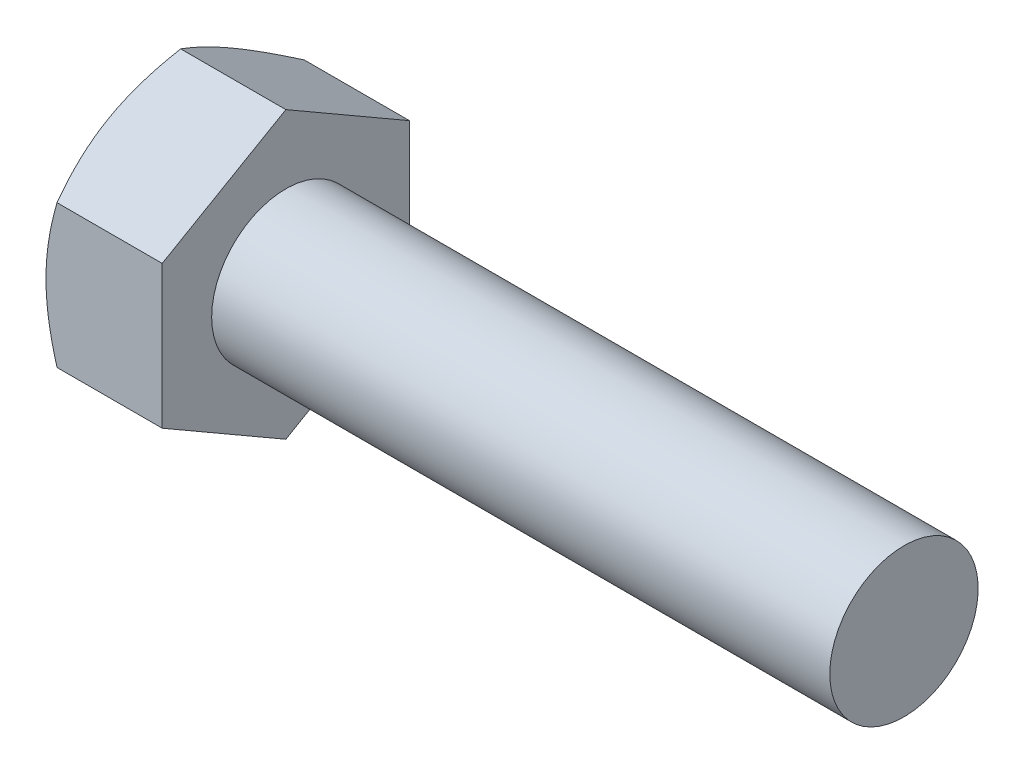
ISO-10303-21;
HEADER;
FILE_DESCRIPTION(('STEP AP214'),'2;1');
FILE_NAME('part.step','',(''),(''),'','','');
FILE_SCHEMA(('AUTOMOTIVE_DESIGN { 1 0 10303 214 1 1 1 1 }'));
ENDSEC;
DATA;
#1=APPLICATION_CONTEXT('core data for automotive mechanical design processes');
#2=APPLICATION_PROTOCOL_DEFINITION('international standard','automotive_design',2000,#1);
#3=PRODUCT_CONTEXT('',#1,'mechanical');
#4=PRODUCT('Part','Part','',(#3));
#5=PRODUCT_RELATED_PRODUCT_CATEGORY('part','',(#4));
#6=PRODUCT_DEFINITION_FORMATION('','',#4);
#7=PRODUCT_DEFINITION_CONTEXT('part definition',#1,'design');
#8=PRODUCT_DEFINITION('design','',#6,#7);
#9=PRODUCT_DEFINITION_SHAPE('','',#8);
#10=(LENGTH_UNIT() NAMED_UNIT(*) SI_UNIT(.MILLI.,.METRE.));
#11=(NAMED_UNIT(*) PLANE_ANGLE_UNIT() SI_UNIT($,.RADIAN.));
#12=(NAMED_UNIT(*) SI_UNIT($,.STERADIAN.) SOLID_ANGLE_UNIT());
#13=UNCERTAINTY_MEASURE_WITH_UNIT(LENGTH_MEASURE(1.E-05),#10,'distance_accuracy_value','');
#14=(GEOMETRIC_REPRESENTATION_CONTEXT(3) GLOBAL_UNCERTAINTY_ASSIGNED_CONTEXT((#13)) GLOBAL_UNIT_ASSIGNED_CONTEXT((#10,
#11,#12)) REPRESENTATION_CONTEXT('',''));
#15=CARTESIAN_POINT('',(0.,0.,0.));
#16=DIRECTION('',(0.,0.,1.));
#17=DIRECTION('',(1.,0.,0.));
#18=AXIS2_PLACEMENT_3D('',#15,#16,#17);
#19=CARTESIAN_POINT('',(0.5875,0.,0.));
#20=DIRECTION('',(1.,0.,0.));
#21=DIRECTION('',(0.,0.,-1.));
#22=AXIS2_PLACEMENT_3D('',#19,#20,#21);
#23=PLANE('',#22);
#24=CARTESIAN_POINT('',(0.5875,0.,0.));
#25=DIRECTION('',(-1.,0.,0.));
#26=DIRECTION('',(0.,0.,1.));
#27=AXIS2_PLACEMENT_3D('',#24,#25,#26);
#28=CIRCLE('',#27,4.375);
#29=CARTESIAN_POINT('',(0.5875,0.,4.375));
#30=VERTEX_POINT('',#29);
#31=EDGE_CURVE('E20',#30,#30,#28,.T.);
#32=ORIENTED_EDGE('',*,*,#31,.T.);
#33=EDGE_LOOP('',(#32));
#34=FACE_BOUND('',#33,.T.);
#35=ADVANCED_FACE('F17',(#34),#23,.F.);
#36=CARTESIAN_POINT('',(0.5875,0.,0.));
#37=DIRECTION('',(-1.,0.,0.));
#38=DIRECTION('',(0.,0.,1.));
#39=AXIS2_PLACEMENT_3D('',#36,#37,#38);
#40=CYLINDRICAL_SURFACE('',#39,4.375);
#41=ORIENTED_EDGE('',*,*,#31,.F.);
#42=EDGE_LOOP('',(#41));
#43=FACE_BOUND('',#42,.T.);
#44=CARTESIAN_POINT('',(0.,0.,0.));
#45=DIRECTION('',(-1.,0.,0.));
#46=DIRECTION('',(0.,0.,1.));
#47=AXIS2_PLACEMENT_3D('',#44,#45,#46);
#48=CIRCLE('',#47,4.375);
#49=CARTESIAN_POINT('',(0.,0.,4.375));
#50=VERTEX_POINT('',#49);
#51=EDGE_CURVE('E95',#50,#50,#48,.F.);
#52=ORIENTED_EDGE('',*,*,#51,.F.);
#53=EDGE_LOOP('',(#52));
#54=FACE_BOUND('',#53,.T.);
#55=ADVANCED_FACE('F313',(#43,#54),#40,.F.);
#56=CARTESIAN_POINT('',(0.,0.,0.));
#57=DIRECTION('',(-1.,0.,0.));
#58=DIRECTION('',(0.,0.,1.));
#59=AXIS2_PLACEMENT_3D('',#56,#57,#58);
#60=PLANE('',#59);
#61=ORIENTED_EDGE('',*,*,#51,.T.);
#62=EDGE_LOOP('',(#61));
#63=FACE_BOUND('',#62,.T.);
#64=CARTESIAN_POINT('',(7.105427357601E-09,0.,0.));
#65=DIRECTION('',(1.,0.,0.));
#66=DIRECTION('',(0.,1.,0.));
#67=AXIS2_PLACEMENT_3D('',#64,#65,#66);
#68=CIRCLE('',#67,5.00000001227363);
#69=CARTESIAN_POINT('',(4.7401377688661E-09,-4.33012702838319,2.50000001638704));
#70=VERTEX_POINT('',#69);
#71=CARTESIAN_POINT('',(8.27623421337969E-09,-4.33012702660206,-2.5000000153587));
#72=VERTEX_POINT('',#71);
#73=EDGE_CURVE('E300',#70,#72,#68,.T.);
#74=ORIENTED_EDGE('',*,*,#73,.F.);
#75=CARTESIAN_POINT('',(0.,0.,0.));
#76=DIRECTION('',(1.,0.,0.));
#77=DIRECTION('',(0.,0.,-1.));
#78=AXIS2_PLACEMENT_3D('',#75,#76,#77);
#79=CIRCLE('',#78,4.99999999999545);
#80=CARTESIAN_POINT('',(3.54440478703144E-09,0.,4.99999999999773));
#81=VERTEX_POINT('',#80);
#82=EDGE_CURVE('E442',#81,#70,#79,.T.);
#83=ORIENTED_EDGE('',*,*,#82,.F.);
#84=CARTESIAN_POINT('',(7.08880962827299E-09,0.,0.));
#85=DIRECTION('',(1.,0.,0.));
#86=DIRECTION('',(0.,0.,-1.));
#87=AXIS2_PLACEMENT_3D('',#84,#85,#86);
#88=CIRCLE('',#87,5.00000001227363);
#89=CARTESIAN_POINT('',(8.27629756135944E-09,4.33012702660215,2.50000001535876));
#90=VERTEX_POINT('',#89);
#91=EDGE_CURVE('E91',#90,#81,#88,.T.);
#92=ORIENTED_EDGE('',*,*,#91,.F.);
#93=CARTESIAN_POINT('',(7.105427357601E-09,0.,0.));
#94=DIRECTION('',(1.,0.,0.));
#95=DIRECTION('',(0.,1.,0.));
#96=AXIS2_PLACEMENT_3D('',#93,#94,#95);
#97=CIRCLE('',#96,5.00000001227363);
#98=CARTESIAN_POINT('',(4.7402021295438E-09,4.33012702838339,-2.50000001638716));
#99=VERTEX_POINT('',#98);
#100=EDGE_CURVE('E85',#99,#90,#97,.T.);
#101=ORIENTED_EDGE('',*,*,#100,.F.);
#102=CARTESIAN_POINT('',(0.,0.,0.));
#103=DIRECTION('',(1.,0.,0.));
#104=DIRECTION('',(0.,0.,-1.));
#105=AXIS2_PLACEMENT_3D('',#102,#103,#104);
#106=CIRCLE('',#105,4.99999999999545);
#107=CARTESIAN_POINT('',(3.54440503097693E-09,0.,-4.99999999999773));
#108=VERTEX_POINT('',#107);
#109=EDGE_CURVE('E88',#108,#99,#106,.T.);
#110=ORIENTED_EDGE('',*,*,#109,.F.);
#111=CARTESIAN_POINT('',(7.08881011616397E-09,0.,0.));
#112=DIRECTION('',(1.,0.,0.));
#113=DIRECTION('',(0.,0.,-1.));
#114=AXIS2_PLACEMENT_3D('',#111,#112,#113);
#115=CIRCLE('',#114,5.00000001227363);
#116=EDGE_CURVE('E106',#72,#108,#115,.T.);
#117=ORIENTED_EDGE('',*,*,#116,.F.);
#118=EDGE_LOOP('',(#74,#83,#92,#101,#110,#117));
#119=FACE_BOUND('',#118,.T.);
#120=ADVANCED_FACE('F87',(#63,#119),#60,.T.);
#121=CARTESIAN_POINT('',(0.449261493940867,0.,0.));
#122=DIRECTION('',(1.,0.,0.));
#123=DIRECTION('',(0.,1.,0.));
#124=AXIS2_PLACEMENT_3D('',#121,#122,#123);
#125=CONICAL_SURFACE('',#124,5.77814373338015,1.04719755120973);
#126=CARTESIAN_POINT('',(9.33024145912172E-09,4.33012702860863,-2.5000000165172));
#127=CARTESIAN_POINT('',(-2.04253876691126E-05,4.39139022924448,-2.39388904051192));
#128=CARTESIAN_POINT('',(0.00259979996646319,4.45265047870994,-2.28778317628033));
#129=CARTESIAN_POINT('',(0.0129696889106451,4.57505069234628,-2.07577978823127));
#130=CARTESIAN_POINT('',(0.0207183370339176,4.63619067792704,-1.96988222733075));
#131=CARTESIAN_POINT('',(0.0411421651140092,4.75795544791058,-1.75897946009568));
#132=CARTESIAN_POINT('',(0.0537925438077498,4.81858128030084,-1.6539724385938));
#133=CARTESIAN_POINT('',(0.0837477185240875,4.93954410264598,-1.4444586853733));
#134=CARTESIAN_POINT('',(0.1010526370577,4.99988108495556,-1.33995196689674));
#135=CARTESIAN_POINT('',(0.159414607944622,5.18020865494931,-1.02761545503101));
#136=CARTESIAN_POINT('',(0.20694721451758,5.29967538428081,-0.820693010917681));
#137=CARTESIAN_POINT('',(0.316569562845942,5.537581481527,-0.408627564854847));
#138=CARTESIAN_POINT('',(0.378732005448972,5.65601255106241,-0.203498936119839));
#139=CARTESIAN_POINT('',(0.446582001956851,5.77350271712522,-1.31628116747698E-12));
#140=B_SPLINE_CURVE_WITH_KNOTS('',3,(#126,#127,#128,#129,#130,#131,#132,#133,#134,#135,#136,
#137,#138,#139),.UNSPECIFIED.,.F.,.F.,(4,2,2,2,2,2,4),(0.,0.367541691354156,0.735010628417449,
1.10064406492518,1.46628712612392,2.19661490580317,2.93065156989514),.UNSPECIFIED.);
#141=CARTESIAN_POINT('',(0.44658200195707,5.7735027171256,6.55285862712924E-13));
#142=VERTEX_POINT('',#141);
#143=EDGE_CURVE('E109',#99,#142,#140,.T.);
#144=ORIENTED_EDGE('',*,*,#143,.F.);
#145=ORIENTED_EDGE('',*,*,#100,.T.);
#146=CARTESIAN_POINT('',(0.44658200195685,5.77350271712522,1.31231125997748E-12));
#147=CARTESIAN_POINT('',(0.37873200544453,5.65601255105726,0.203498936131457));
#148=CARTESIAN_POINT('',(0.316569562838844,5.53758148151482,0.408627564877297));
#149=CARTESIAN_POINT('',(0.206947214507334,5.29967538425538,0.820693010960385));
#150=CARTESIAN_POINT('',(0.159414607933761,5.18020865491769,1.02761545508311));
#151=CARTESIAN_POINT('',(0.101052637045332,4.99988108491638,1.33995196696594));
#152=CARTESIAN_POINT('',(0.083747718511046,4.93954410260415,1.44445868544942));
#153=CARTESIAN_POINT('',(0.0537925437975042,4.81858128024865,1.65397243868053));
#154=CARTESIAN_POINT('',(0.0411421651072185,4.75795544785068,1.7589794601861));
#155=CARTESIAN_POINT('',(0.0207183370212629,4.63619067787114,1.96988222744097));
#156=CARTESIAN_POINT('',(0.0129696888886612,4.57505069230219,2.07577978835766));
#157=CARTESIAN_POINT('',(0.00259979997654614,4.45265047861339,2.28778317639752));
#158=CARTESIAN_POINT('',(-2.0425336135652E-05,4.39139022908364,2.39388904060373));
#159=CARTESIAN_POINT('',(9.48040308033562E-09,4.33012702829776,2.50000001653546));
#160=B_SPLINE_CURVE_WITH_KNOTS('',3,(#146,#147,#148,#149,#150,#151,#152,#153,#154,#155,#156,
#157,#158,#159),.UNSPECIFIED.,.F.,.F.,(4,2,2,2,2,2,4),(0.,0.734036664131566,1.46436444384436,
1.83000750506485,2.19564094159321,2.56310987868116,2.93065157006315),.UNSPECIFIED.);
#161=EDGE_CURVE('E112',#142,#90,#160,.T.);
#162=ORIENTED_EDGE('',*,*,#161,.F.);
#163=EDGE_LOOP('',(#144,#145,#162));
#164=FACE_BOUND('',#163,.T.);
#165=ADVANCED_FACE('F110',(#164),#125,.T.);
#166=CARTESIAN_POINT('',(0.449261482970087,0.,0.));
#167=DIRECTION('',(1.,0.,0.));
#168=DIRECTION('',(0.,0.,-1.));
#169=AXIS2_PLACEMENT_3D('',#166,#167,#168);
#170=CONICAL_SURFACE('',#169,5.7781437143376,1.04719755117112);
#171=CARTESIAN_POINT('',(2.62571862107434E-12,0.,-5.));
#172=CARTESIAN_POINT('',(-2.04348114206199E-05,0.122526400761557,-5.));
#173=CARTESIAN_POINT('',(0.00259979049502645,0.245046899010864,-5.));
#174=CARTESIAN_POINT('',(0.0129696793776766,0.489847324769537,-5.));
#175=CARTESIAN_POINT('',(0.0207183274870514,0.612127295098707,-5.));
#176=CARTESIAN_POINT('',(0.0411421555101734,0.855656833447012,-5.));
#177=CARTESIAN_POINT('',(0.0537925341609345,0.976908497440895,-5.));
#178=CARTESIAN_POINT('',(0.0837477087799368,1.2188341405515,-5.));
#179=CARTESIAN_POINT('',(0.101052627259207,1.33950810437762,-5.));
#180=CARTESIAN_POINT('',(0.159414597961098,1.7001632419941,-5.));
#181=CARTESIAN_POINT('',(0.206947204381568,1.93909669908845,-5.));
#182=CARTESIAN_POINT('',(0.316569552358383,2.41490889045852,-5.));
#183=CARTESIAN_POINT('',(0.378731994762238,2.65177102797574,-5.));
#184=CARTESIAN_POINT('',(0.446581991053766,2.88675135855628,-5.));
#185=B_SPLINE_CURVE_WITH_KNOTS('',3,(#171,#172,#173,#174,#175,#176,#177,#178,#179,#180,#181,
#182,#183,#184),.UNSPECIFIED.,.F.,.F.,(4,2,2,2,2,2,4),(0.,0.367541690156254,0.735010626018703,
1.10064406132765,1.4662871213287,2.19661489860577,2.93065156028933),.UNSPECIFIED.);
#186=CARTESIAN_POINT('',(0.446581991054608,2.88675135856498,-4.99999999999667));
#187=VERTEX_POINT('',#186);
#188=EDGE_CURVE('E104',#108,#187,#185,.T.);
#189=ORIENTED_EDGE('',*,*,#188,.F.);
#190=ORIENTED_EDGE('',*,*,#109,.T.);
#191=CARTESIAN_POINT('',(0.44658199105027,2.88675135857106,-4.99999999999681));
#192=CARTESIAN_POINT('',(0.378731996062227,3.00424152313926,-4.79650106645737));
#193=CARTESIAN_POINT('',(0.316569554908551,3.12267259116002,-4.59137244034442));
#194=CARTESIAN_POINT('',(0.206947209200851,3.36057868534821,-4.17930699957895));
#195=CARTESIAN_POINT('',(0.159414603801788,3.48004541313672,-3.97238455814026));
#196=CARTESIAN_POINT('',(0.101052634388757,3.66037298077315,-3.6600480503538));
#197=CARTESIAN_POINT('',(0.0837477162990158,3.72070996228813,-3.55554133325112));
#198=CARTESIAN_POINT('',(0.0537925423615912,3.8416727830386,-3.34602758279997));
#199=CARTESIAN_POINT('',(0.0411421640028899,3.90229861462877,-3.24102056269356));
#200=CARTESIAN_POINT('',(0.0207183364558777,4.0240633829749,-3.03011779826785));
#201=CARTESIAN_POINT('',(0.012969688529538,4.08520336771818,-2.92422023878127));
#202=CARTESIAN_POINT('',(0.00259979989330513,4.20760357975054,-2.71221685361044));
#203=CARTESIAN_POINT('',(-2.04253498375979E-05,4.26886382844952,-2.60611099084316));
#204=CARTESIAN_POINT('',(9.46378671368228E-09,4.33012702840446,-2.50000001635065));
#205=B_SPLINE_CURVE_WITH_KNOTS('',3,(#191,#192,#193,#194,#195,#196,#197,#198,#199,#200,#201,
#202,#203,#204),.UNSPECIFIED.,.F.,.F.,(4,2,2,2,2,2,4),(0.,0.734036654219952,1.46436442414071,
1.83000748043996,2.19564091204796,2.56310984415688,2.930651530555),.UNSPECIFIED.);
#206=EDGE_CURVE('E101',#187,#99,#205,.T.);
#207=ORIENTED_EDGE('',*,*,#206,.F.);
#208=EDGE_LOOP('',(#189,#190,#207));
#209=FACE_BOUND('',#208,.T.);
#210=ADVANCED_FACE('F99',(#209),#170,.T.);
#211=CARTESIAN_POINT('',(0.449261482970087,0.,0.));
#212=DIRECTION('',(1.,0.,0.));
#213=DIRECTION('',(0.,0.,-1.));
#214=AXIS2_PLACEMENT_3D('',#211,#212,#213);
#215=CONICAL_SURFACE('',#214,5.7781437143376,1.04719755117112);
#216=CARTESIAN_POINT('',(8.8745944342073E-09,-4.33012702926679,-2.50000001689719));
#217=CARTESIAN_POINT('',(-2.04255610579813E-05,-4.26886382875445,-2.60611099104729));
#218=CARTESIAN_POINT('',(0.00259979983692972,-4.20760357982974,-2.71221685366911));
#219=CARTESIAN_POINT('',(0.0129696885858374,-4.08520336763634,-2.92422023872629));
#220=CARTESIAN_POINT('',(0.020718336470219,-4.02406338295769,-3.03011779824464));
#221=CARTESIAN_POINT('',(0.0411421639859489,-3.90229861465992,-3.24102056269147));
#222=CARTESIAN_POINT('',(0.0537925423552585,-3.84167278305389,-3.34602758278745));
#223=CARTESIAN_POINT('',(0.0837477163001016,-3.72070996229263,-3.55554133322847));
#224=CARTESIAN_POINT('',(0.101052634386596,-3.66037298078271,-3.66004805033146));
#225=CARTESIAN_POINT('',(0.159414603794992,-3.48004541315023,-3.97238455812705));
#226=CARTESIAN_POINT('',(0.206947209196612,-3.36057868535577,-4.1793069995716));
#227=CARTESIAN_POINT('',(0.316569554909921,-3.12267259115779,-4.5913724403416));
#228=CARTESIAN_POINT('',(0.378731996066245,-3.00424152313312,-4.79650106645329));
#229=CARTESIAN_POINT('',(0.44658199105369,-2.88675135856618,-4.99999999999414));
#230=B_SPLINE_CURVE_WITH_KNOTS('',3,(#216,#217,#218,#219,#220,#221,#222,#223,#224,#225,#226,
#227,#228,#229),.UNSPECIFIED.,.F.,.F.,(4,2,2,2,2,2,4),(0.,0.367541686368646,0.735010618460503,
1.10064405006579,1.46628710635791,2.19661487630298,2.93065153052634),.UNSPECIFIED.);
#231=CARTESIAN_POINT('',(0.446581991054533,-2.88675135855895,-5.));
#232=VERTEX_POINT('',#231);
#233=EDGE_CURVE('E182',#72,#232,#230,.T.);
#234=ORIENTED_EDGE('',*,*,#233,.F.);
#235=ORIENTED_EDGE('',*,*,#116,.T.);
#236=CARTESIAN_POINT('',(0.446581991050195,-2.88675135855603,-5.00000000000534));
#237=CARTESIAN_POINT('',(0.378731994760839,-2.65177102797506,-5.00000000000186));
#238=CARTESIAN_POINT('',(0.316569552357875,-2.41490889045775,-5.00000000000049));
#239=CARTESIAN_POINT('',(0.206947204381736,-1.93909669908776,-4.99999999999951));
#240=CARTESIAN_POINT('',(0.159414597961058,-1.70016324199358,-4.99999999999991));
#241=CARTESIAN_POINT('',(0.101052627259122,-1.33950810437724,-5.00000000000004));
#242=CARTESIAN_POINT('',(0.0837477087798799,-1.21883414055115,-5.00000000000001));
#243=CARTESIAN_POINT('',(0.0537925341609072,-0.976908497440582,-4.99999999999999));
#244=CARTESIAN_POINT('',(0.0411421555101476,-0.855656833446722,-5.));
#245=CARTESIAN_POINT('',(0.0207183274870341,-0.612127295098481,-5.));
#246=CARTESIAN_POINT('',(0.0129696793776657,-0.489847324769351,-5.));
#247=CARTESIAN_POINT('',(0.00259979049502528,-0.245046899010768,-5.));
#248=CARTESIAN_POINT('',(-2.04348114187193E-05,-0.12252640076151,-5.));
#249=CARTESIAN_POINT('',(2.62576268769501E-12,0.,-5.));
#250=B_SPLINE_CURVE_WITH_KNOTS('',3,(#236,#237,#238,#239,#240,#241,#242,#243,#244,#245,#246,
#247,#248,#249),.UNSPECIFIED.,.F.,.F.,(4,2,2,2,2,2,4),(0.,0.734036661683138,1.4643644389599,
1.83000749896087,2.19564093426975,2.56310987013207,2.93065156028818),.UNSPECIFIED.);
#251=EDGE_CURVE('E158',#232,#108,#250,.T.);
#252=ORIENTED_EDGE('',*,*,#251,.F.);
#253=EDGE_LOOP('',(#234,#235,#252));
#254=FACE_BOUND('',#253,.T.);
#255=ADVANCED_FACE('F146',(#254),#215,.T.);
#256=CARTESIAN_POINT('',(0.449261493940867,0.,0.));
#257=DIRECTION('',(1.,0.,0.));
#258=DIRECTION('',(0.,1.,0.));
#259=AXIS2_PLACEMENT_3D('',#256,#257,#258);
#260=CONICAL_SURFACE('',#259,5.77814373338015,1.04719755120973);
#261=CARTESIAN_POINT('',(0.446582001956703,-5.77350271712496,-1.3160133465623E-12));
#262=CARTESIAN_POINT('',(0.378732005444387,-5.65601255105701,-0.203498936131451));
#263=CARTESIAN_POINT('',(0.316569562838703,-5.53758148151457,-0.408627564877282));
#264=CARTESIAN_POINT('',(0.206947214507198,-5.29967538425514,-0.820693010960351));
#265=CARTESIAN_POINT('',(0.159414607933626,-5.18020865491746,-1.02761545508307));
#266=CARTESIAN_POINT('',(0.1010526370452,-4.99988108491615,-1.33995196696589));
#267=CARTESIAN_POINT('',(0.083747718510915,-4.93954410260393,-1.44445868544936));
#268=CARTESIAN_POINT('',(0.0537925437973746,-4.81858128024843,-1.65397243868046));
#269=CARTESIAN_POINT('',(0.0411421651070894,-4.75795544785047,-1.75897946018602));
#270=CARTESIAN_POINT('',(0.0207183370211347,-4.63619067787094,-1.96988222744088));
#271=CARTESIAN_POINT('',(0.0129696888885332,-4.57505069230199,-2.07577978835756));
#272=CARTESIAN_POINT('',(0.00259979997641863,-4.45265047861319,-2.28778317639741));
#273=CARTESIAN_POINT('',(-2.04253362630251E-05,-4.39139022908344,-2.39388904060362));
#274=CARTESIAN_POINT('',(9.48027579489469E-09,-4.33012702829757,-2.50000001653535));
#275=B_SPLINE_CURVE_WITH_KNOTS('',3,(#261,#262,#263,#264,#265,#266,#267,#268,#269,#270,#271,
#272,#273,#274),.UNSPECIFIED.,.F.,.F.,(4,2,2,2,2,2,4),(0.,0.734036664131532,1.46436444384429,
1.83000750506477,2.19564094159311,2.56310987868105,2.93065157006301),.UNSPECIFIED.);
#276=CARTESIAN_POINT('',(0.446582001956922,-5.77350271712534,-6.58964229529057E-13));
#277=VERTEX_POINT('',#276);
#278=EDGE_CURVE('E159',#277,#72,#275,.T.);
#279=ORIENTED_EDGE('',*,*,#278,.F.);
#280=CARTESIAN_POINT('',(9.33010754226166E-09,-4.33012702860845,2.50000001651709));
#281=CARTESIAN_POINT('',(-2.04253877999187E-05,-4.39139022924429,2.39388904051181));
#282=CARTESIAN_POINT('',(0.00259979996633343,-4.45265047870974,2.28778317628023));
#283=CARTESIAN_POINT('',(0.0129696889105157,-4.57505069234607,2.07577978823117));
#284=CARTESIAN_POINT('',(0.0207183370337874,-4.63619067792683,1.96988222733066));
#285=CARTESIAN_POINT('',(0.0411421651138782,-4.75795544791037,1.7589794600956));
#286=CARTESIAN_POINT('',(0.0537925438076187,-4.81858128030063,1.65397243859372));
#287=CARTESIAN_POINT('',(0.0837477185239552,-4.93954410264576,1.44445868537323));
#288=CARTESIAN_POINT('',(0.101052637057567,-4.99988108495534,1.33995196689668));
#289=CARTESIAN_POINT('',(0.159414607944486,-5.18020865494908,1.02761545503096));
#290=CARTESIAN_POINT('',(0.206947214517442,-5.29967538428057,0.820693010917643));
#291=CARTESIAN_POINT('',(0.3165695628458,-5.53758148152676,0.408627564854827));
#292=CARTESIAN_POINT('',(0.378732005448827,-5.65601255106216,0.203498936119828));
#293=CARTESIAN_POINT('',(0.446582001956702,-5.77350271712496,1.31401433526088E-12));
#294=B_SPLINE_CURVE_WITH_KNOTS('',3,(#280,#281,#282,#283,#284,#285,#286,#287,#288,#289,#290,
#291,#292,#293),.UNSPECIFIED.,.F.,.F.,(4,2,2,2,2,2,4),(0.,0.367541691354138,0.735010628417416,
1.10064406492513,1.46628712612385,2.19661490580308,2.93065156989501),.UNSPECIFIED.);
#295=EDGE_CURVE('E196',#70,#277,#294,.T.);
#296=ORIENTED_EDGE('',*,*,#295,.F.);
#297=ORIENTED_EDGE('',*,*,#73,.T.);
#298=EDGE_LOOP('',(#279,#296,#297));
#299=FACE_BOUND('',#298,.T.);
#300=ADVANCED_FACE('F299',(#299),#260,.T.);
#301=CARTESIAN_POINT('',(0.449261482970087,0.,0.));
#302=DIRECTION('',(1.,0.,0.));
#303=DIRECTION('',(0.,0.,-1.));
#304=AXIS2_PLACEMENT_3D('',#301,#302,#303);
#305=CONICAL_SURFACE('',#304,5.7781437143376,1.04719755117112);
#306=CARTESIAN_POINT('',(0.446581991050268,2.88675135855628,5.00000000000534));
#307=CARTESIAN_POINT('',(0.378731994760902,2.65177102797529,5.00000000000186));
#308=CARTESIAN_POINT('',(0.316569552357929,2.41490889045797,5.00000000000049));
#309=CARTESIAN_POINT('',(0.206947204381771,1.93909669908793,4.99999999999951));
#310=CARTESIAN_POINT('',(0.159414597961085,1.70016324199373,4.99999999999991));
#311=CARTESIAN_POINT('',(0.10105262725914,1.33950810437736,5.00000000000004));
#312=CARTESIAN_POINT('',(0.0837477087798944,1.21883414055126,5.00000000000001));
#313=CARTESIAN_POINT('',(0.0537925341609162,0.97690849744067,4.99999999999999));
#314=CARTESIAN_POINT('',(0.0411421555101541,0.8556568334468,4.99999999999999));
#315=CARTESIAN_POINT('',(0.0207183274870368,0.612127295098537,5.));
#316=CARTESIAN_POINT('',(0.0129696793776671,0.489847324769396,5.));
#317=CARTESIAN_POINT('',(0.002599790495025,0.245046899010791,5.));
#318=CARTESIAN_POINT('',(-2.04348114194253E-05,0.122526400761521,4.99999999999999));
#319=CARTESIAN_POINT('',(2.62480363464069E-12,0.,5.));
#320=B_SPLINE_CURVE_WITH_KNOTS('',3,(#306,#307,#308,#309,#310,#311,#312,#313,#314,#315,#316,
#317,#318,#319),.UNSPECIFIED.,.F.,.F.,(4,2,2,2,2,2,4),(0.,0.734036661683205,1.46436443896003,
1.83000749896103,2.19564093426994,2.5631098701323,2.93065156028844),.UNSPECIFIED.);
#321=CARTESIAN_POINT('',(0.446581991053495,2.88675135856113,4.99999999999666));
#322=VERTEX_POINT('',#321);
#323=EDGE_CURVE('E218',#322,#81,#320,.T.);
#324=ORIENTED_EDGE('',*,*,#323,.F.);
#325=CARTESIAN_POINT('',(8.87472562423004E-09,4.33012702926697,2.5000000168973));
#326=CARTESIAN_POINT('',(-2.04255609297146E-05,4.26886382875464,2.6061109910474));
#327=CARTESIAN_POINT('',(0.00259979983705656,4.20760357982994,2.71221685366921));
#328=CARTESIAN_POINT('',(0.0129696885859623,4.08520336763655,2.92422023872638));
#329=CARTESIAN_POINT('',(0.0207183364703432,4.0240633829579,3.03011779824472));
#330=CARTESIAN_POINT('',(0.0411421639860707,3.90229861466013,3.24102056269155));
#331=CARTESIAN_POINT('',(0.0537925423553785,3.8416727830541,3.34602758278752));
#332=CARTESIAN_POINT('',(0.0837477163002175,3.72070996229285,3.55554133322854));
#333=CARTESIAN_POINT('',(0.10105263438671,3.66037298078294,3.66004805033152));
#334=CARTESIAN_POINT('',(0.159414603795098,3.48004541315046,3.97238455812709));
#335=CARTESIAN_POINT('',(0.206947209196713,3.36057868535601,4.17930699957164));
#336=CARTESIAN_POINT('',(0.316569554910009,3.12267259115803,4.59137244034162));
#337=CARTESIAN_POINT('',(0.378731996066326,3.00424152313337,4.7965010664533));
#338=CARTESIAN_POINT('',(0.446581991053764,2.88675135856644,4.99999999999414));
#339=B_SPLINE_CURVE_WITH_KNOTS('',3,(#325,#326,#327,#328,#329,#330,#331,#332,#333,#334,#335,
#336,#337,#338),.UNSPECIFIED.,.F.,.F.,(4,2,2,2,2,2,4),(0.,0.367541686368629,0.735010618460468,
1.10064405006574,1.46628710635784,2.19661487630288,2.9306515305262),.UNSPECIFIED.);
#340=EDGE_CURVE('E122',#90,#322,#339,.T.);
#341=ORIENTED_EDGE('',*,*,#340,.F.);
#342=ORIENTED_EDGE('',*,*,#91,.T.);
#343=EDGE_LOOP('',(#324,#341,#342));
#344=FACE_BOUND('',#343,.T.);
#345=ADVANCED_FACE('F205',(#344),#305,.T.);
#346=CARTESIAN_POINT('',(0.449261482970087,0.,0.));
#347=DIRECTION('',(1.,0.,0.));
#348=DIRECTION('',(0.,0.,-1.));
#349=AXIS2_PLACEMENT_3D('',#346,#347,#348);
#350=CONICAL_SURFACE('',#349,5.7781437143376,1.04719755117112);
#351=CARTESIAN_POINT('',(0.446581991050194,-2.88675135857081,4.99999999999681));
#352=CARTESIAN_POINT('',(0.378731996062144,-3.00424152313901,4.79650106645736));
#353=CARTESIAN_POINT('',(0.316569554908461,-3.12267259115977,4.5913724403444));
#354=CARTESIAN_POINT('',(0.206947209200748,-3.36057868534797,4.17930699957891));
#355=CARTESIAN_POINT('',(0.159414603801679,-3.48004541313649,3.97238455814022));
#356=CARTESIAN_POINT('',(0.10105263438864,-3.66037298077293,3.66004805035374));
#357=CARTESIAN_POINT('',(0.0837477162988975,-3.72070996228791,3.55554133325105));
#358=CARTESIAN_POINT('',(0.0537925423614691,-3.84167278303838,3.3460275827999));
#359=CARTESIAN_POINT('',(0.0411421640027663,-3.90229861462856,3.24102056269348));
#360=CARTESIAN_POINT('',(0.0207183364557513,-4.0240633829747,3.03011779826776));
#361=CARTESIAN_POINT('',(0.0129696885294104,-4.08520336771797,2.92422023878117));
#362=CARTESIAN_POINT('',(0.00259979989317593,-4.20760357975034,2.71221685361034));
#363=CARTESIAN_POINT('',(-2.04253499670997E-05,-4.26886382844933,2.60611099084305));
#364=CARTESIAN_POINT('',(9.4636577860781E-09,-4.33012702840427,2.50000001635054));
#365=B_SPLINE_CURVE_WITH_KNOTS('',3,(#351,#352,#353,#354,#355,#356,#357,#358,#359,#360,#361,
#362,#363,#364),.UNSPECIFIED.,.F.,.F.,(4,2,2,2,2,2,4),(0.,0.734036654219988,1.46436442414078,
1.83000748044005,2.19564091204806,2.563109844157,2.93065153055514),.UNSPECIFIED.);
#366=CARTESIAN_POINT('',(0.446581991054533,-2.88675135856472,4.99999999999666));
#367=VERTEX_POINT('',#366);
#368=EDGE_CURVE('E189',#367,#70,#365,.T.);
#369=ORIENTED_EDGE('',*,*,#368,.F.);
#370=CARTESIAN_POINT('',(2.62477095213116E-12,0.,5.));
#371=CARTESIAN_POINT('',(-2.043481142178E-05,-0.122526400761547,5.));
#372=CARTESIAN_POINT('',(0.00259979049502482,-0.245046899010842,5.));
#373=CARTESIAN_POINT('',(0.0129696793776732,-0.489847324769492,5.));
#374=CARTESIAN_POINT('',(0.0207183274870467,-0.612127295098652,5.));
#375=CARTESIAN_POINT('',(0.0411421555101649,-0.855656833446934,5.));
#376=CARTESIAN_POINT('',(0.0537925341609235,-0.976908497440807,5.));
#377=CARTESIAN_POINT('',(0.0837477087799203,-1.21883414055139,5.));
#378=CARTESIAN_POINT('',(0.101052627259188,-1.3395081043775,5.));
#379=CARTESIAN_POINT('',(0.159414597961068,-1.70016324199395,5.));
#380=CARTESIAN_POINT('',(0.20694720438153,-1.93909669908828,5.));
#381=CARTESIAN_POINT('',(0.316569552358329,-2.41490889045831,5.));
#382=CARTESIAN_POINT('',(0.378731994762174,-2.6517710279755,5.));
#383=CARTESIAN_POINT('',(0.44658199105369,-2.88675135855603,5.));
#384=B_SPLINE_CURVE_WITH_KNOTS('',3,(#370,#371,#372,#373,#374,#375,#376,#377,#378,#379,#380,
#381,#382,#383),.UNSPECIFIED.,.F.,.F.,(4,2,2,2,2,2,4),(0.,0.367541690156221,0.735010626018636,
1.10064406132755,1.46628712132856,2.19661489860557,2.93065156028906),.UNSPECIFIED.);
#385=EDGE_CURVE('E211',#81,#367,#384,.T.);
#386=ORIENTED_EDGE('',*,*,#385,.F.);
#387=ORIENTED_EDGE('',*,*,#82,.T.);
#388=EDGE_LOOP('',(#369,#386,#387));
#389=FACE_BOUND('',#388,.T.);
#390=ADVANCED_FACE('F201',(#389),#350,.T.);
#391=CARTESIAN_POINT('',(4.7,2.88675135856305,5.));
#392=DIRECTION('',(0.,0.866025402838329,0.50000000163871));
#393=DIRECTION('',(0.,-0.50000000163871,0.866025402838329));
#394=AXIS2_PLACEMENT_3D('',#391,#392,#393);
#395=PLANE('',#394);
#396=ORIENTED_EDGE('',*,*,#161,.T.);
#397=ORIENTED_EDGE('',*,*,#340,.T.);
#398=DIRECTION('',(1.,0.,0.));
#399=VECTOR('',#398,1.);
#400=CARTESIAN_POINT('',(4.7,2.88675135856305,5.));
#401=LINE('',#400,#399);
#402=CARTESIAN_POINT('',(4.7,2.88675135856305,5.));
#403=VERTEX_POINT('',#402);
#404=EDGE_CURVE('E449',#403,#322,#401,.F.);
#405=ORIENTED_EDGE('',*,*,#404,.F.);
#406=DIRECTION('',(0.,0.50000000163871,-0.866025402838329));
#407=VECTOR('',#406,1.);
#408=CARTESIAN_POINT('',(4.7,2.88675135856305,5.));
#409=LINE('',#408,#407);
#410=CARTESIAN_POINT('',(4.7,5.77350271712598,0.));
#411=VERTEX_POINT('',#410);
#412=EDGE_CURVE('E217',#403,#411,#409,.T.);
#413=ORIENTED_EDGE('',*,*,#412,.T.);
#414=DIRECTION('',(1.,0.,0.));
#415=VECTOR('',#414,1.);
#416=CARTESIAN_POINT('',(4.7,5.77350271712598,0.));
#417=LINE('',#416,#415);
#418=EDGE_CURVE('E120',#142,#411,#417,.T.);
#419=ORIENTED_EDGE('',*,*,#418,.F.);
#420=EDGE_LOOP('',(#396,#397,#405,#413,#419));
#421=FACE_BOUND('',#420,.T.);
#422=ADVANCED_FACE('F204',(#421),#395,.T.);
#423=CARTESIAN_POINT('',(4.7,5.77350271712598,0.));
#424=DIRECTION('',(0.,0.866025402838329,-0.50000000163871));
#425=DIRECTION('',(0.,0.50000000163871,0.866025402838329));
#426=AXIS2_PLACEMENT_3D('',#423,#424,#425);
#427=PLANE('',#426);
#428=ORIENTED_EDGE('',*,*,#206,.T.);
#429=ORIENTED_EDGE('',*,*,#143,.T.);
#430=ORIENTED_EDGE('',*,*,#418,.T.);
#431=DIRECTION('',(0.,-0.50000000163871,-0.866025402838329));
#432=VECTOR('',#431,1.);
#433=CARTESIAN_POINT('',(4.7,5.77350271712598,0.));
#434=LINE('',#433,#432);
#435=CARTESIAN_POINT('',(4.7,2.88675135856305,-5.));
#436=VERTEX_POINT('',#435);
#437=EDGE_CURVE('E260',#411,#436,#434,.T.);
#438=ORIENTED_EDGE('',*,*,#437,.T.);
#439=DIRECTION('',(1.,0.,0.));
#440=VECTOR('',#439,1.);
#441=CARTESIAN_POINT('',(4.7,2.88675135856305,-5.));
#442=LINE('',#441,#440);
#443=EDGE_CURVE('E116',#187,#436,#442,.T.);
#444=ORIENTED_EDGE('',*,*,#443,.F.);
#445=EDGE_LOOP('',(#428,#429,#430,#438,#444));
#446=FACE_BOUND('',#445,.T.);
#447=ADVANCED_FACE('F118',(#446),#427,.T.);
#448=CARTESIAN_POINT('',(4.7,2.88675135856305,-5.));
#449=DIRECTION('',(0.,0.,-1.));
#450=DIRECTION('',(0.,1.,0.));
#451=AXIS2_PLACEMENT_3D('',#448,#449,#450);
#452=PLANE('',#451);
#453=ORIENTED_EDGE('',*,*,#251,.T.);
#454=ORIENTED_EDGE('',*,*,#188,.T.);
#455=ORIENTED_EDGE('',*,*,#443,.T.);
#456=DIRECTION('',(0.,1.,0.));
#457=VECTOR('',#456,1.);
#458=CARTESIAN_POINT('',(4.7,3.,-5.));
#459=LINE('',#458,#457);
#460=CARTESIAN_POINT('',(4.7,-2.8867513585628,-5.));
#461=VERTEX_POINT('',#460);
#462=EDGE_CURVE('E266',#436,#461,#459,.F.);
#463=ORIENTED_EDGE('',*,*,#462,.T.);
#464=DIRECTION('',(1.,0.,0.));
#465=VECTOR('',#464,1.);
#466=CARTESIAN_POINT('',(4.7,-2.8867513585628,-5.));
#467=LINE('',#466,#465);
#468=EDGE_CURVE('E157',#232,#461,#467,.T.);
#469=ORIENTED_EDGE('',*,*,#468,.F.);
#470=EDGE_LOOP('',(#453,#454,#455,#463,#469));
#471=FACE_BOUND('',#470,.T.);
#472=ADVANCED_FACE('F168',(#471),#452,.T.);
#473=CARTESIAN_POINT('',(4.7,-2.8867513585628,-5.));
#474=DIRECTION('',(0.,-0.866025402838329,-0.50000000163871));
#475=DIRECTION('',(0.,0.50000000163871,-0.866025402838329));
#476=AXIS2_PLACEMENT_3D('',#473,#474,#475);
#477=PLANE('',#476);
#478=ORIENTED_EDGE('',*,*,#278,.T.);
#479=ORIENTED_EDGE('',*,*,#233,.T.);
#480=ORIENTED_EDGE('',*,*,#468,.T.);
#481=DIRECTION('',(0.,-0.50000000163871,0.866025402838329));
#482=VECTOR('',#481,1.);
#483=CARTESIAN_POINT('',(4.7,-2.8867513585628,-5.));
#484=LINE('',#483,#482);
#485=CARTESIAN_POINT('',(4.7,-5.77350271712572,0.));
#486=VERTEX_POINT('',#485);
#487=EDGE_CURVE('E252',#461,#486,#484,.T.);
#488=ORIENTED_EDGE('',*,*,#487,.T.);
#489=DIRECTION('',(1.,0.,0.));
#490=VECTOR('',#489,1.);
#491=CARTESIAN_POINT('',(4.7,-5.77350271712572,0.));
#492=LINE('',#491,#490);
#493=EDGE_CURVE('E188',#277,#486,#492,.T.);
#494=ORIENTED_EDGE('',*,*,#493,.F.);
#495=EDGE_LOOP('',(#478,#479,#480,#488,#494));
#496=FACE_BOUND('',#495,.T.);
#497=ADVANCED_FACE('F171',(#496),#477,.T.);
#498=CARTESIAN_POINT('',(4.7,-5.77350271712572,0.));
#499=DIRECTION('',(0.,-0.866025402838329,0.50000000163871));
#500=DIRECTION('',(0.,-0.50000000163871,-0.866025402838329));
#501=AXIS2_PLACEMENT_3D('',#498,#499,#500);
#502=PLANE('',#501);
#503=ORIENTED_EDGE('',*,*,#368,.T.);
#504=ORIENTED_EDGE('',*,*,#295,.T.);
#505=ORIENTED_EDGE('',*,*,#493,.T.);
#506=DIRECTION('',(0.,0.50000000163871,0.866025402838329));
#507=VECTOR('',#506,1.);
#508=CARTESIAN_POINT('',(4.7,-5.77350271712572,0.));
#509=LINE('',#508,#507);
#510=CARTESIAN_POINT('',(4.7,-2.8867513585628,5.));
#511=VERTEX_POINT('',#510);
#512=EDGE_CURVE('E35',#486,#511,#509,.T.);
#513=ORIENTED_EDGE('',*,*,#512,.T.);
#514=DIRECTION('',(1.,0.,0.));
#515=VECTOR('',#514,1.);
#516=CARTESIAN_POINT('',(4.7,-2.8867513585628,5.));
#517=LINE('',#516,#515);
#518=EDGE_CURVE('E450',#367,#511,#517,.T.);
#519=ORIENTED_EDGE('',*,*,#518,.F.);
#520=EDGE_LOOP('',(#503,#504,#505,#513,#519));
#521=FACE_BOUND('',#520,.T.);
#522=ADVANCED_FACE('F177',(#521),#502,.T.);
#523=CARTESIAN_POINT('',(4.7,-2.8867513585628,5.));
#524=DIRECTION('',(0.,0.,1.));
#525=DIRECTION('',(0.,-1.,0.));
#526=AXIS2_PLACEMENT_3D('',#523,#524,#525);
#527=PLANE('',#526);
#528=ORIENTED_EDGE('',*,*,#323,.T.);
#529=ORIENTED_EDGE('',*,*,#385,.T.);
#530=ORIENTED_EDGE('',*,*,#518,.T.);
#531=DIRECTION('',(0.,1.,0.));
#532=VECTOR('',#531,1.);
#533=CARTESIAN_POINT('',(4.7,3.,5.));
#534=LINE('',#533,#532);
#535=EDGE_CURVE('E246',#511,#403,#534,.T.);
#536=ORIENTED_EDGE('',*,*,#535,.T.);
#537=ORIENTED_EDGE('',*,*,#404,.T.);
#538=EDGE_LOOP('',(#528,#529,#530,#536,#537));
#539=FACE_BOUND('',#538,.T.);
#540=ADVANCED_FACE('F222',(#539),#527,.T.);
#541=CARTESIAN_POINT('',(29.7,3.,0.));
#542=DIRECTION('',(1.,0.,0.));
#543=DIRECTION('',(0.,0.,-1.));
#544=AXIS2_PLACEMENT_3D('',#541,#542,#543);
#545=PLANE('',#544);
#546=CARTESIAN_POINT('',(29.7,0.,0.));
#547=DIRECTION('',(-1.,0.,0.));
#548=DIRECTION('',(0.,0.,1.));
#549=AXIS2_PLACEMENT_3D('',#546,#547,#548);
#550=CIRCLE('',#549,3.);
#551=CARTESIAN_POINT('',(29.7,0.,3.));
#552=VERTEX_POINT('',#551);
#553=EDGE_CURVE('E26',#552,#552,#550,.T.);
#554=ORIENTED_EDGE('',*,*,#553,.F.);
#555=EDGE_LOOP('',(#554));
#556=FACE_BOUND('',#555,.T.);
#557=ADVANCED_FACE('F226',(#556),#545,.T.);
#558=CARTESIAN_POINT('',(4.7,3.,0.));
#559=DIRECTION('',(-1.,0.,0.));
#560=DIRECTION('',(0.,0.,1.));
#561=AXIS2_PLACEMENT_3D('',#558,#559,#560);
#562=PLANE('',#561);
#563=ORIENTED_EDGE('',*,*,#512,.F.);
#564=ORIENTED_EDGE('',*,*,#487,.F.);
#565=ORIENTED_EDGE('',*,*,#462,.F.);
#566=ORIENTED_EDGE('',*,*,#437,.F.);
#567=ORIENTED_EDGE('',*,*,#412,.F.);
#568=ORIENTED_EDGE('',*,*,#535,.F.);
#569=EDGE_LOOP('',(#563,#564,#565,#566,#567,#568));
#570=FACE_BOUND('',#569,.T.);
#571=CARTESIAN_POINT('',(4.7,0.,0.));
#572=DIRECTION('',(-1.,0.,0.));
#573=DIRECTION('',(0.,0.,1.));
#574=AXIS2_PLACEMENT_3D('',#571,#572,#573);
#575=CIRCLE('',#574,3.);
#576=CARTESIAN_POINT('',(4.7,0.,3.));
#577=VERTEX_POINT('',#576);
#578=EDGE_CURVE('E11',#577,#577,#575,.F.);
#579=ORIENTED_EDGE('',*,*,#578,.F.);
#580=EDGE_LOOP('',(#579));
#581=FACE_BOUND('',#580,.T.);
#582=ADVANCED_FACE('F231',(#570,#581),#562,.F.);
#583=CARTESIAN_POINT('',(-25.4,0.,0.));
#584=DIRECTION('',(-1.,0.,0.));
#585=DIRECTION('',(0.,0.,1.));
#586=AXIS2_PLACEMENT_3D('',#583,#584,#585);
#587=CYLINDRICAL_SURFACE('',#586,3.);
#588=ORIENTED_EDGE('',*,*,#578,.T.);
#589=EDGE_LOOP('',(#588));
#590=FACE_BOUND('',#589,.T.);
#591=ORIENTED_EDGE('',*,*,#553,.T.);
#592=EDGE_LOOP('',(#591));
#593=FACE_BOUND('',#592,.T.);
#594=ADVANCED_FACE('F235',(#590,#593),#587,.T.);
#595=CLOSED_SHELL('',(#35,#55,#120,#165,#210,#255,#300,#345,#390,#422,#447,#472,#497,#522,#540,
#557,#582,#594));
#596=MANIFOLD_SOLID_BREP('B1',#595);
#597=ADVANCED_BREP_SHAPE_REPRESENTATION('',(#18,#596),#14);
#598=SHAPE_DEFINITION_REPRESENTATION(#9,#597);
ENDSEC;
END-ISO-10303-21;
